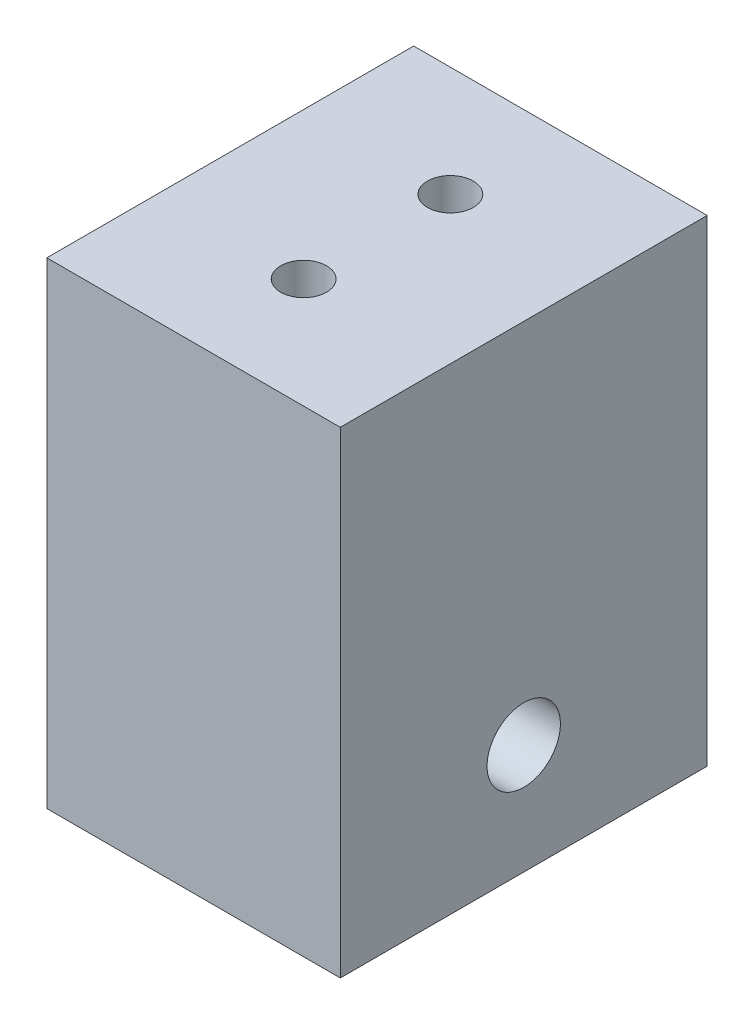
ISO-10303-21;
HEADER;
FILE_DESCRIPTION(('STEP AP214'),'2;1');
FILE_NAME('part.step','',(''),(''),'','','');
FILE_SCHEMA(('AUTOMOTIVE_DESIGN { 1 0 10303 214 1 1 1 1 }'));
ENDSEC;
DATA;
#1=APPLICATION_CONTEXT('core data for automotive mechanical design processes');
#2=APPLICATION_PROTOCOL_DEFINITION('international standard','automotive_design',2000,#1);
#3=PRODUCT_CONTEXT('',#1,'mechanical');
#4=PRODUCT('Part','Part','',(#3));
#5=PRODUCT_RELATED_PRODUCT_CATEGORY('part','',(#4));
#6=PRODUCT_DEFINITION_FORMATION('','',#4);
#7=PRODUCT_DEFINITION_CONTEXT('part definition',#1,'design');
#8=PRODUCT_DEFINITION('design','',#6,#7);
#9=PRODUCT_DEFINITION_SHAPE('','',#8);
#10=(LENGTH_UNIT() NAMED_UNIT(*) SI_UNIT(.MILLI.,.METRE.));
#11=(NAMED_UNIT(*) PLANE_ANGLE_UNIT() SI_UNIT($,.RADIAN.));
#12=(NAMED_UNIT(*) SI_UNIT($,.STERADIAN.) SOLID_ANGLE_UNIT());
#13=UNCERTAINTY_MEASURE_WITH_UNIT(LENGTH_MEASURE(1.E-05),#10,'distance_accuracy_value','');
#14=(GEOMETRIC_REPRESENTATION_CONTEXT(3) GLOBAL_UNCERTAINTY_ASSIGNED_CONTEXT((#13)) GLOBAL_UNIT_ASSIGNED_CONTEXT((#10,
#11,#12)) REPRESENTATION_CONTEXT('',''));
#15=CARTESIAN_POINT('',(0.,0.,0.));
#16=DIRECTION('',(0.,0.,1.));
#17=DIRECTION('',(1.,0.,0.));
#18=AXIS2_PLACEMENT_3D('',#15,#16,#17);
#19=CARTESIAN_POINT('',(12.7,41.275,15.875));
#20=DIRECTION('',(-1.,0.,0.));
#21=DIRECTION('',(0.,0.,1.));
#22=AXIS2_PLACEMENT_3D('',#19,#20,#21);
#23=PLANE('',#22);
#24=CARTESIAN_POINT('',(12.7,9.525,0.));
#25=DIRECTION('',(1.,0.,0.));
#26=DIRECTION('',(0.,0.,-1.));
#27=AXIS2_PLACEMENT_3D('',#24,#25,#26);
#28=CIRCLE('',#27,3.175);
#29=CARTESIAN_POINT('',(12.7,9.525,-3.175));
#30=VERTEX_POINT('',#29);
#31=EDGE_CURVE('E109',#30,#30,#28,.T.);
#32=ORIENTED_EDGE('',*,*,#31,.F.);
#33=EDGE_LOOP('',(#32));
#34=FACE_BOUND('',#33,.T.);
#35=DIRECTION('',(0.,0.,-1.));
#36=VECTOR('',#35,1.);
#37=CARTESIAN_POINT('',(12.7,0.,15.875));
#38=LINE('',#37,#36);
#39=CARTESIAN_POINT('',(12.7,0.,15.875));
#40=VERTEX_POINT('',#39);
#41=CARTESIAN_POINT('',(12.7,0.,-15.875));
#42=VERTEX_POINT('',#41);
#43=EDGE_CURVE('E95',#40,#42,#38,.T.);
#44=ORIENTED_EDGE('',*,*,#43,.T.);
#45=DIRECTION('',(0.,-1.,0.));
#46=VECTOR('',#45,1.);
#47=CARTESIAN_POINT('',(12.7,41.275,-15.875));
#48=LINE('',#47,#46);
#49=CARTESIAN_POINT('',(12.7,41.275,-15.875));
#50=VERTEX_POINT('',#49);
#51=EDGE_CURVE('E11',#50,#42,#48,.T.);
#52=ORIENTED_EDGE('',*,*,#51,.F.);
#53=DIRECTION('',(0.,0.,-1.));
#54=VECTOR('',#53,1.);
#55=CARTESIAN_POINT('',(12.7,41.275,15.875));
#56=LINE('',#55,#54);
#57=CARTESIAN_POINT('',(12.7,41.275,15.875));
#58=VERTEX_POINT('',#57);
#59=EDGE_CURVE('E83',#58,#50,#56,.T.);
#60=ORIENTED_EDGE('',*,*,#59,.F.);
#61=DIRECTION('',(0.,-1.,0.));
#62=VECTOR('',#61,1.);
#63=CARTESIAN_POINT('',(12.7,41.275,15.875));
#64=LINE('',#63,#62);
#65=EDGE_CURVE('E91',#58,#40,#64,.T.);
#66=ORIENTED_EDGE('',*,*,#65,.T.);
#67=EDGE_LOOP('',(#44,#52,#60,#66));
#68=FACE_BOUND('',#67,.T.);
#69=ADVANCED_FACE('F32',(#34,#68),#23,.F.);
#70=CARTESIAN_POINT('',(-12.7,41.275,-15.875));
#71=DIRECTION('',(0.,0.,1.));
#72=DIRECTION('',(1.,0.,0.));
#73=AXIS2_PLACEMENT_3D('',#70,#71,#72);
#74=PLANE('',#73);
#75=DIRECTION('',(-1.,0.,0.));
#76=VECTOR('',#75,1.);
#77=CARTESIAN_POINT('',(-12.7,0.,-15.875));
#78=LINE('',#77,#76);
#79=CARTESIAN_POINT('',(-12.7,0.,-15.875));
#80=VERTEX_POINT('',#79);
#81=EDGE_CURVE('E87',#42,#80,#78,.T.);
#82=ORIENTED_EDGE('',*,*,#81,.T.);
#83=DIRECTION('',(0.,-1.,0.));
#84=VECTOR('',#83,1.);
#85=CARTESIAN_POINT('',(-12.7,41.275,-15.875));
#86=LINE('',#85,#84);
#87=CARTESIAN_POINT('',(-12.7,41.275,-15.875));
#88=VERTEX_POINT('',#87);
#89=EDGE_CURVE('E40',#88,#80,#86,.T.);
#90=ORIENTED_EDGE('',*,*,#89,.F.);
#91=DIRECTION('',(-1.,0.,0.));
#92=VECTOR('',#91,1.);
#93=CARTESIAN_POINT('',(-12.7,41.275,-15.875));
#94=LINE('',#93,#92);
#95=EDGE_CURVE('E78',#50,#88,#94,.T.);
#96=ORIENTED_EDGE('',*,*,#95,.F.);
#97=ORIENTED_EDGE('',*,*,#51,.T.);
#98=EDGE_LOOP('',(#82,#90,#96,#97));
#99=FACE_BOUND('',#98,.T.);
#100=ADVANCED_FACE('F86',(#99),#74,.F.);
#101=CARTESIAN_POINT('',(-12.7,41.275,15.875));
#102=DIRECTION('',(1.,0.,0.));
#103=DIRECTION('',(0.,0.,-1.));
#104=AXIS2_PLACEMENT_3D('',#101,#102,#103);
#105=PLANE('',#104);
#106=CARTESIAN_POINT('',(-12.7,9.525,0.));
#107=DIRECTION('',(1.,0.,0.));
#108=DIRECTION('',(0.,0.,-1.));
#109=AXIS2_PLACEMENT_3D('',#106,#107,#108);
#110=CIRCLE('',#109,3.175);
#111=CARTESIAN_POINT('',(-12.7,9.525,-3.175));
#112=VERTEX_POINT('',#111);
#113=EDGE_CURVE('E98',#112,#112,#110,.T.);
#114=ORIENTED_EDGE('',*,*,#113,.T.);
#115=EDGE_LOOP('',(#114));
#116=FACE_BOUND('',#115,.T.);
#117=DIRECTION('',(0.,0.,1.));
#118=VECTOR('',#117,1.);
#119=CARTESIAN_POINT('',(-12.7,0.,15.875));
#120=LINE('',#119,#118);
#121=CARTESIAN_POINT('',(-12.7,0.,15.875));
#122=VERTEX_POINT('',#121);
#123=EDGE_CURVE('E65',#80,#122,#120,.T.);
#124=ORIENTED_EDGE('',*,*,#123,.T.);
#125=DIRECTION('',(0.,-1.,0.));
#126=VECTOR('',#125,1.);
#127=CARTESIAN_POINT('',(-12.7,41.275,15.875));
#128=LINE('',#127,#126);
#129=CARTESIAN_POINT('',(-12.7,41.275,15.875));
#130=VERTEX_POINT('',#129);
#131=EDGE_CURVE('E88',#130,#122,#128,.T.);
#132=ORIENTED_EDGE('',*,*,#131,.F.);
#133=DIRECTION('',(0.,0.,1.));
#134=VECTOR('',#133,1.);
#135=CARTESIAN_POINT('',(-12.7,41.275,15.875));
#136=LINE('',#135,#134);
#137=EDGE_CURVE('E81',#88,#130,#136,.T.);
#138=ORIENTED_EDGE('',*,*,#137,.F.);
#139=ORIENTED_EDGE('',*,*,#89,.T.);
#140=EDGE_LOOP('',(#124,#132,#138,#139));
#141=FACE_BOUND('',#140,.T.);
#142=ADVANCED_FACE('F89',(#116,#141),#105,.F.);
#143=CARTESIAN_POINT('',(-12.7,41.275,15.875));
#144=DIRECTION('',(0.,0.,-1.));
#145=DIRECTION('',(-1.,0.,0.));
#146=AXIS2_PLACEMENT_3D('',#143,#144,#145);
#147=PLANE('',#146);
#148=DIRECTION('',(1.,0.,0.));
#149=VECTOR('',#148,1.);
#150=CARTESIAN_POINT('',(-12.7,0.,15.875));
#151=LINE('',#150,#149);
#152=EDGE_CURVE('E71',#122,#40,#151,.T.);
#153=ORIENTED_EDGE('',*,*,#152,.T.);
#154=ORIENTED_EDGE('',*,*,#65,.F.);
#155=DIRECTION('',(1.,0.,0.));
#156=VECTOR('',#155,1.);
#157=CARTESIAN_POINT('',(-12.7,41.275,15.875));
#158=LINE('',#157,#156);
#159=EDGE_CURVE('E48',#130,#58,#158,.T.);
#160=ORIENTED_EDGE('',*,*,#159,.F.);
#161=ORIENTED_EDGE('',*,*,#131,.T.);
#162=EDGE_LOOP('',(#153,#154,#160,#161));
#163=FACE_BOUND('',#162,.T.);
#164=ADVANCED_FACE('F103',(#163),#147,.F.);
#165=CARTESIAN_POINT('',(0.,41.275,0.));
#166=DIRECTION('',(0.,-1.,0.));
#167=DIRECTION('',(0.,0.,-1.));
#168=AXIS2_PLACEMENT_3D('',#165,#166,#167);
#169=PLANE('',#168);
#170=CARTESIAN_POINT('',(0.,41.275,6.35));
#171=DIRECTION('',(0.,1.,0.));
#172=DIRECTION('',(0.,0.,1.));
#173=AXIS2_PLACEMENT_3D('',#170,#171,#172);
#174=CIRCLE('',#173,1.984375);
#175=CARTESIAN_POINT('',(0.,41.275,8.334375));
#176=VERTEX_POINT('',#175);
#177=EDGE_CURVE('E121',#176,#176,#174,.T.);
#178=ORIENTED_EDGE('',*,*,#177,.F.);
#179=EDGE_LOOP('',(#178));
#180=FACE_BOUND('',#179,.T.);
#181=CARTESIAN_POINT('',(0.,41.275,-6.35));
#182=DIRECTION('',(0.,1.,0.));
#183=DIRECTION('',(0.,0.,1.));
#184=AXIS2_PLACEMENT_3D('',#181,#182,#183);
#185=CIRCLE('',#184,1.984375);
#186=CARTESIAN_POINT('',(0.,41.275,-4.365625));
#187=VERTEX_POINT('',#186);
#188=EDGE_CURVE('E115',#187,#187,#185,.T.);
#189=ORIENTED_EDGE('',*,*,#188,.F.);
#190=EDGE_LOOP('',(#189));
#191=FACE_BOUND('',#190,.T.);
#192=ORIENTED_EDGE('',*,*,#59,.T.);
#193=ORIENTED_EDGE('',*,*,#95,.T.);
#194=ORIENTED_EDGE('',*,*,#137,.T.);
#195=ORIENTED_EDGE('',*,*,#159,.T.);
#196=EDGE_LOOP('',(#192,#193,#194,#195));
#197=FACE_BOUND('',#196,.T.);
#198=ADVANCED_FACE('F79',(#180,#191,#197),#169,.F.);
#199=CARTESIAN_POINT('',(0.,0.,0.));
#200=DIRECTION('',(0.,-1.,0.));
#201=DIRECTION('',(0.,0.,-1.));
#202=AXIS2_PLACEMENT_3D('',#199,#200,#201);
#203=PLANE('',#202);
#204=ORIENTED_EDGE('',*,*,#43,.F.);
#205=ORIENTED_EDGE('',*,*,#152,.F.);
#206=ORIENTED_EDGE('',*,*,#123,.F.);
#207=ORIENTED_EDGE('',*,*,#81,.F.);
#208=EDGE_LOOP('',(#204,#205,#206,#207));
#209=FACE_BOUND('',#208,.T.);
#210=ADVANCED_FACE('F106',(#209),#203,.T.);
#211=CARTESIAN_POINT('',(-12.7,9.525,0.));
#212=DIRECTION('',(1.,0.,0.));
#213=DIRECTION('',(0.,0.,-1.));
#214=AXIS2_PLACEMENT_3D('',#211,#212,#213);
#215=CYLINDRICAL_SURFACE('',#214,3.175);
#216=ORIENTED_EDGE('',*,*,#113,.F.);
#217=EDGE_LOOP('',(#216));
#218=FACE_BOUND('',#217,.T.);
#219=ORIENTED_EDGE('',*,*,#31,.T.);
#220=EDGE_LOOP('',(#219));
#221=FACE_BOUND('',#220,.T.);
#222=ADVANCED_FACE('F143',(#218,#221),#215,.F.);
#223=CARTESIAN_POINT('',(0.,15.875,-6.35));
#224=DIRECTION('',(0.,1.,0.));
#225=DIRECTION('',(0.,0.,1.));
#226=AXIS2_PLACEMENT_3D('',#223,#224,#225);
#227=CYLINDRICAL_SURFACE('',#226,1.984375);
#228=CARTESIAN_POINT('',(0.,15.875,-6.35));
#229=DIRECTION('',(0.,1.,0.));
#230=DIRECTION('',(0.,0.,1.));
#231=AXIS2_PLACEMENT_3D('',#228,#229,#230);
#232=CIRCLE('',#231,1.984375);
#233=CARTESIAN_POINT('',(0.,15.875,-4.365625));
#234=VERTEX_POINT('',#233);
#235=EDGE_CURVE('E112',#234,#234,#232,.T.);
#236=ORIENTED_EDGE('',*,*,#235,.F.);
#237=EDGE_LOOP('',(#236));
#238=FACE_BOUND('',#237,.T.);
#239=ORIENTED_EDGE('',*,*,#188,.T.);
#240=EDGE_LOOP('',(#239));
#241=FACE_BOUND('',#240,.T.);
#242=ADVANCED_FACE('F141',(#238,#241),#227,.F.);
#243=CARTESIAN_POINT('',(0.,15.875,-6.35));
#244=DIRECTION('',(0.,1.,0.));
#245=DIRECTION('',(0.,0.,1.));
#246=AXIS2_PLACEMENT_3D('',#243,#244,#245);
#247=PLANE('',#246);
#248=ORIENTED_EDGE('',*,*,#235,.T.);
#249=EDGE_LOOP('',(#248));
#250=FACE_BOUND('',#249,.T.);
#251=ADVANCED_FACE('F132',(#250),#247,.T.);
#252=CARTESIAN_POINT('',(0.,15.875,6.35));
#253=DIRECTION('',(0.,1.,0.));
#254=DIRECTION('',(0.,0.,1.));
#255=AXIS2_PLACEMENT_3D('',#252,#253,#254);
#256=CYLINDRICAL_SURFACE('',#255,1.984375);
#257=CARTESIAN_POINT('',(0.,15.875,6.35));
#258=DIRECTION('',(0.,1.,0.));
#259=DIRECTION('',(0.,0.,1.));
#260=AXIS2_PLACEMENT_3D('',#257,#258,#259);
#261=CIRCLE('',#260,1.984375);
#262=CARTESIAN_POINT('',(0.,15.875,8.334375));
#263=VERTEX_POINT('',#262);
#264=EDGE_CURVE('E118',#263,#263,#261,.T.);
#265=ORIENTED_EDGE('',*,*,#264,.F.);
#266=EDGE_LOOP('',(#265));
#267=FACE_BOUND('',#266,.T.);
#268=ORIENTED_EDGE('',*,*,#177,.T.);
#269=EDGE_LOOP('',(#268));
#270=FACE_BOUND('',#269,.T.);
#271=ADVANCED_FACE('F129',(#267,#270),#256,.F.);
#272=CARTESIAN_POINT('',(0.,15.875,6.35));
#273=DIRECTION('',(0.,1.,0.));
#274=DIRECTION('',(0.,0.,1.));
#275=AXIS2_PLACEMENT_3D('',#272,#273,#274);
#276=PLANE('',#275);
#277=ORIENTED_EDGE('',*,*,#264,.T.);
#278=EDGE_LOOP('',(#277));
#279=FACE_BOUND('',#278,.T.);
#280=ADVANCED_FACE('F127',(#279),#276,.T.);
#281=CLOSED_SHELL('',(#69,#100,#142,#164,#198,#210,#222,#242,#251,#271,#280));
#282=MANIFOLD_SOLID_BREP('B2',#281);
#283=ADVANCED_BREP_SHAPE_REPRESENTATION('',(#18,#282),#14);
#284=SHAPE_DEFINITION_REPRESENTATION(#9,#283);
ENDSEC;
END-ISO-10303-21;
